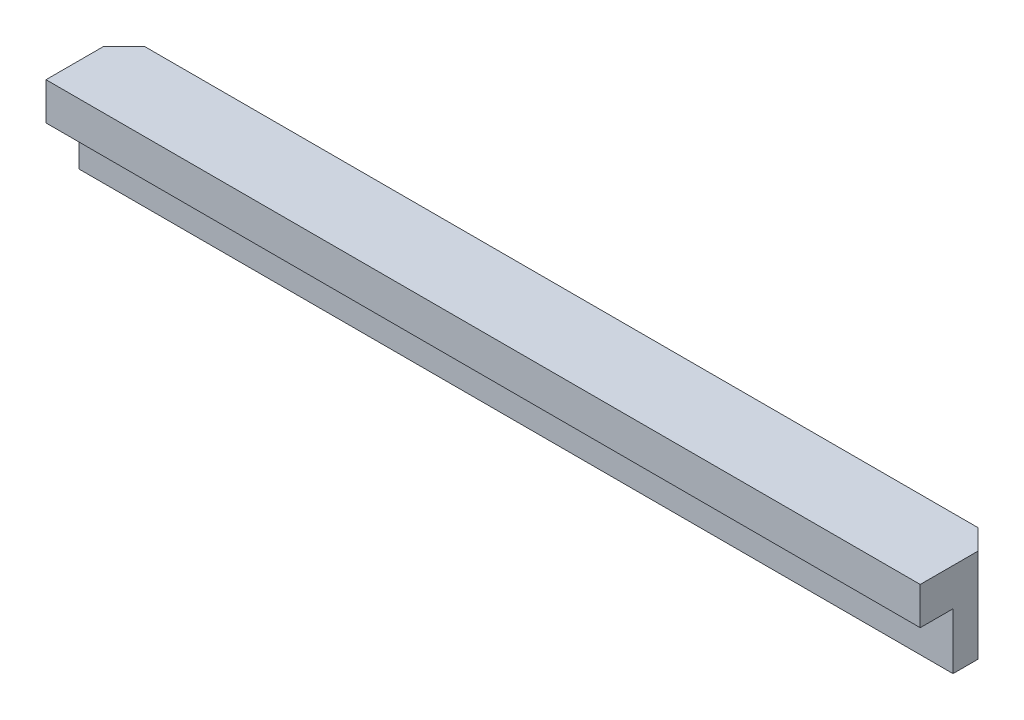
ISO-10303-21;
HEADER;
FILE_DESCRIPTION(('STEP AP214'),'2;1');
FILE_NAME('part.step','',(''),(''),'','','');
FILE_SCHEMA(('AUTOMOTIVE_DESIGN { 1 0 10303 214 1 1 1 1 }'));
ENDSEC;
DATA;
#1=APPLICATION_CONTEXT('core data for automotive mechanical design processes');
#2=APPLICATION_PROTOCOL_DEFINITION('international standard','automotive_design',2000,#1);
#3=PRODUCT_CONTEXT('',#1,'mechanical');
#4=PRODUCT('Part','Part','',(#3));
#5=PRODUCT_RELATED_PRODUCT_CATEGORY('part','',(#4));
#6=PRODUCT_DEFINITION_FORMATION('','',#4);
#7=PRODUCT_DEFINITION_CONTEXT('part definition',#1,'design');
#8=PRODUCT_DEFINITION('design','',#6,#7);
#9=PRODUCT_DEFINITION_SHAPE('','',#8);
#10=(LENGTH_UNIT() NAMED_UNIT(*) SI_UNIT(.MILLI.,.METRE.));
#11=(NAMED_UNIT(*) PLANE_ANGLE_UNIT() SI_UNIT($,.RADIAN.));
#12=(NAMED_UNIT(*) SI_UNIT($,.STERADIAN.) SOLID_ANGLE_UNIT());
#13=UNCERTAINTY_MEASURE_WITH_UNIT(LENGTH_MEASURE(1.E-05),#10,'distance_accuracy_value','');
#14=(GEOMETRIC_REPRESENTATION_CONTEXT(3) GLOBAL_UNCERTAINTY_ASSIGNED_CONTEXT((#13)) GLOBAL_UNIT_ASSIGNED_CONTEXT((#10,
#11,#12)) REPRESENTATION_CONTEXT('',''));
#15=CARTESIAN_POINT('',(0.,0.,0.));
#16=DIRECTION('',(0.,0.,1.));
#17=DIRECTION('',(1.,0.,0.));
#18=AXIS2_PLACEMENT_3D('',#15,#16,#17);
#19=CARTESIAN_POINT('',(140.,30.,-12.5));
#20=DIRECTION('',(-1.,0.,0.));
#21=DIRECTION('',(0.,0.,1.));
#22=AXIS2_PLACEMENT_3D('',#19,#20,#21);
#23=PLANE('',#22);
#24=DIRECTION('',(0.,0.,-1.));
#25=VECTOR('',#24,1.);
#26=CARTESIAN_POINT('',(140.,0.,-12.5));
#27=LINE('',#26,#25);
#28=CARTESIAN_POINT('',(140.,0.,2.));
#29=VERTEX_POINT('',#28);
#30=CARTESIAN_POINT('',(140.,0.,-5.99999999999994));
#31=VERTEX_POINT('',#30);
#32=EDGE_CURVE('E114',#29,#31,#27,.T.);
#33=ORIENTED_EDGE('',*,*,#32,.T.);
#34=DIRECTION('',(0.,1.,0.));
#35=VECTOR('',#34,1.);
#36=CARTESIAN_POINT('',(140.,30.,-5.99999999999994));
#37=LINE('',#36,#35);
#38=CARTESIAN_POINT('',(140.,30.,-5.99999999999991));
#39=VERTEX_POINT('',#38);
#40=EDGE_CURVE('E11',#31,#39,#37,.T.);
#41=ORIENTED_EDGE('',*,*,#40,.T.);
#42=DIRECTION('',(0.,0.,-1.));
#43=VECTOR('',#42,1.);
#44=CARTESIAN_POINT('',(140.,30.,-12.5));
#45=LINE('',#44,#43);
#46=CARTESIAN_POINT('',(140.,30.,12.5));
#47=VERTEX_POINT('',#46);
#48=EDGE_CURVE('E133',#47,#39,#45,.T.);
#49=ORIENTED_EDGE('',*,*,#48,.F.);
#50=DIRECTION('',(0.,-1.,0.));
#51=VECTOR('',#50,1.);
#52=CARTESIAN_POINT('',(140.,30.,12.5));
#53=LINE('',#52,#51);
#54=CARTESIAN_POINT('',(140.,18.,12.5));
#55=VERTEX_POINT('',#54);
#56=EDGE_CURVE('E134',#47,#55,#53,.T.);
#57=ORIENTED_EDGE('',*,*,#56,.T.);
#58=DIRECTION('',(0.,0.,1.));
#59=VECTOR('',#58,1.);
#60=CARTESIAN_POINT('',(140.,18.,12.5));
#61=LINE('',#60,#59);
#62=CARTESIAN_POINT('',(140.,18.,2.));
#63=VERTEX_POINT('',#62);
#64=EDGE_CURVE('E116',#63,#55,#61,.T.);
#65=ORIENTED_EDGE('',*,*,#64,.F.);
#66=DIRECTION('',(0.,1.,0.));
#67=VECTOR('',#66,1.);
#68=CARTESIAN_POINT('',(140.,0.,2.));
#69=LINE('',#68,#67);
#70=EDGE_CURVE('E104',#29,#63,#69,.T.);
#71=ORIENTED_EDGE('',*,*,#70,.F.);
#72=EDGE_LOOP('',(#33,#41,#49,#57,#65,#71));
#73=FACE_BOUND('',#72,.T.);
#74=ADVANCED_FACE('F32',(#73),#23,.F.);
#75=CARTESIAN_POINT('',(-140.,30.,-12.5));
#76=DIRECTION('',(0.,0.,1.));
#77=DIRECTION('',(1.,0.,0.));
#78=AXIS2_PLACEMENT_3D('',#75,#76,#77);
#79=PLANE('',#78);
#80=DIRECTION('',(-1.,0.,0.));
#81=VECTOR('',#80,1.);
#82=CARTESIAN_POINT('',(-140.,0.,-12.5));
#83=LINE('',#82,#81);
#84=CARTESIAN_POINT('',(133.5,0.,-12.5));
#85=VERTEX_POINT('',#84);
#86=CARTESIAN_POINT('',(-133.5,0.,-12.5));
#87=VERTEX_POINT('',#86);
#88=EDGE_CURVE('E121',#85,#87,#83,.T.);
#89=ORIENTED_EDGE('',*,*,#88,.T.);
#90=DIRECTION('',(0.,1.,0.));
#91=VECTOR('',#90,1.);
#92=CARTESIAN_POINT('',(-133.5,30.,-12.5));
#93=LINE('',#92,#91);
#94=CARTESIAN_POINT('',(-133.5,30.,-12.5));
#95=VERTEX_POINT('',#94);
#96=EDGE_CURVE('E53',#87,#95,#93,.T.);
#97=ORIENTED_EDGE('',*,*,#96,.T.);
#98=DIRECTION('',(-1.,0.,0.));
#99=VECTOR('',#98,1.);
#100=CARTESIAN_POINT('',(-140.,30.,-12.5));
#101=LINE('',#100,#99);
#102=CARTESIAN_POINT('',(133.5,30.,-12.5));
#103=VERTEX_POINT('',#102);
#104=EDGE_CURVE('E154',#103,#95,#101,.T.);
#105=ORIENTED_EDGE('',*,*,#104,.F.);
#106=DIRECTION('',(0.,-1.,0.));
#107=VECTOR('',#106,1.);
#108=CARTESIAN_POINT('',(133.5,30.,-12.5));
#109=LINE('',#108,#107);
#110=EDGE_CURVE('E143',#103,#85,#109,.T.);
#111=ORIENTED_EDGE('',*,*,#110,.T.);
#112=EDGE_LOOP('',(#89,#97,#105,#111));
#113=FACE_BOUND('',#112,.T.);
#114=ADVANCED_FACE('F161',(#113),#79,.F.);
#115=CARTESIAN_POINT('',(-140.,30.,-12.5));
#116=DIRECTION('',(1.,0.,0.));
#117=DIRECTION('',(0.,0.,-1.));
#118=AXIS2_PLACEMENT_3D('',#115,#116,#117);
#119=PLANE('',#118);
#120=DIRECTION('',(0.,0.,1.));
#121=VECTOR('',#120,1.);
#122=CARTESIAN_POINT('',(-140.,30.,-12.5));
#123=LINE('',#122,#121);
#124=CARTESIAN_POINT('',(-140.,30.,-5.99999999999997));
#125=VERTEX_POINT('',#124);
#126=CARTESIAN_POINT('',(-140.,30.,12.5));
#127=VERTEX_POINT('',#126);
#128=EDGE_CURVE('E152',#125,#127,#123,.T.);
#129=ORIENTED_EDGE('',*,*,#128,.F.);
#130=DIRECTION('',(0.,-1.,0.));
#131=VECTOR('',#130,1.);
#132=CARTESIAN_POINT('',(-140.,30.,-5.99999999999999));
#133=LINE('',#132,#131);
#134=CARTESIAN_POINT('',(-140.,0.,-6.));
#135=VERTEX_POINT('',#134);
#136=EDGE_CURVE('E111',#125,#135,#133,.T.);
#137=ORIENTED_EDGE('',*,*,#136,.T.);
#138=DIRECTION('',(0.,0.,1.));
#139=VECTOR('',#138,1.);
#140=CARTESIAN_POINT('',(-140.,0.,-12.5));
#141=LINE('',#140,#139);
#142=CARTESIAN_POINT('',(-140.,0.,2.));
#143=VERTEX_POINT('',#142);
#144=EDGE_CURVE('E124',#135,#143,#141,.T.);
#145=ORIENTED_EDGE('',*,*,#144,.T.);
#146=DIRECTION('',(0.,1.,0.));
#147=VECTOR('',#146,1.);
#148=CARTESIAN_POINT('',(-140.,30.,2.));
#149=LINE('',#148,#147);
#150=CARTESIAN_POINT('',(-140.,18.,2.));
#151=VERTEX_POINT('',#150);
#152=EDGE_CURVE('E107',#143,#151,#149,.T.);
#153=ORIENTED_EDGE('',*,*,#152,.T.);
#154=DIRECTION('',(0.,0.,1.));
#155=VECTOR('',#154,1.);
#156=CARTESIAN_POINT('',(-140.,18.,-12.5));
#157=LINE('',#156,#155);
#158=CARTESIAN_POINT('',(-140.,18.,12.5));
#159=VERTEX_POINT('',#158);
#160=EDGE_CURVE('E122',#151,#159,#157,.T.);
#161=ORIENTED_EDGE('',*,*,#160,.T.);
#162=DIRECTION('',(0.,-1.,0.));
#163=VECTOR('',#162,1.);
#164=CARTESIAN_POINT('',(-140.,30.,12.5));
#165=LINE('',#164,#163);
#166=EDGE_CURVE('E112',#127,#159,#165,.T.);
#167=ORIENTED_EDGE('',*,*,#166,.F.);
#168=EDGE_LOOP('',(#129,#137,#145,#153,#161,#167));
#169=FACE_BOUND('',#168,.T.);
#170=ADVANCED_FACE('F158',(#169),#119,.F.);
#171=CARTESIAN_POINT('',(-140.,30.,12.5));
#172=DIRECTION('',(0.,0.,-1.));
#173=DIRECTION('',(-1.,0.,0.));
#174=AXIS2_PLACEMENT_3D('',#171,#172,#173);
#175=PLANE('',#174);
#176=ORIENTED_EDGE('',*,*,#166,.T.);
#177=DIRECTION('',(1.,0.,0.));
#178=VECTOR('',#177,1.);
#179=CARTESIAN_POINT('',(-160.,18.,12.5));
#180=LINE('',#179,#178);
#181=EDGE_CURVE('E170',#159,#55,#180,.T.);
#182=ORIENTED_EDGE('',*,*,#181,.T.);
#183=ORIENTED_EDGE('',*,*,#56,.F.);
#184=DIRECTION('',(1.,0.,0.));
#185=VECTOR('',#184,1.);
#186=CARTESIAN_POINT('',(-140.,30.,12.5));
#187=LINE('',#186,#185);
#188=EDGE_CURVE('E129',#127,#47,#187,.T.);
#189=ORIENTED_EDGE('',*,*,#188,.F.);
#190=EDGE_LOOP('',(#176,#182,#183,#189));
#191=FACE_BOUND('',#190,.T.);
#192=ADVANCED_FACE('F178',(#191),#175,.F.);
#193=CARTESIAN_POINT('',(0.,30.,0.));
#194=DIRECTION('',(0.,1.,0.));
#195=DIRECTION('',(0.,0.,1.));
#196=AXIS2_PLACEMENT_3D('',#193,#194,#195);
#197=PLANE('',#196);
#198=ORIENTED_EDGE('',*,*,#104,.T.);
#199=DIRECTION('',(0.707106781186551,0.,-0.707106781186545));
#200=VECTOR('',#199,1.);
#201=CARTESIAN_POINT('',(-72.9999999999994,30.,-73.));
#202=LINE('',#201,#200);
#203=EDGE_CURVE('E40',#95,#125,#202,.F.);
#204=ORIENTED_EDGE('',*,*,#203,.T.);
#205=ORIENTED_EDGE('',*,*,#128,.T.);
#206=ORIENTED_EDGE('',*,*,#188,.T.);
#207=ORIENTED_EDGE('',*,*,#48,.T.);
#208=DIRECTION('',(0.707106781186545,0.,0.707106781186551));
#209=VECTOR('',#208,1.);
#210=CARTESIAN_POINT('',(73.0000000000006,30.,-73.));
#211=LINE('',#210,#209);
#212=EDGE_CURVE('E147',#39,#103,#211,.F.);
#213=ORIENTED_EDGE('',*,*,#212,.T.);
#214=EDGE_LOOP('',(#198,#204,#205,#206,#207,#213));
#215=FACE_BOUND('',#214,.T.);
#216=ADVANCED_FACE('F151',(#215),#197,.T.);
#217=CARTESIAN_POINT('',(0.,0.,0.));
#218=DIRECTION('',(0.,1.,0.));
#219=DIRECTION('',(0.,0.,1.));
#220=AXIS2_PLACEMENT_3D('',#217,#218,#219);
#221=PLANE('',#220);
#222=ORIENTED_EDGE('',*,*,#144,.F.);
#223=DIRECTION('',(-0.707106781186551,0.,0.707106781186545));
#224=VECTOR('',#223,1.);
#225=CARTESIAN_POINT('',(-140.,0.,-5.99999999999999));
#226=LINE('',#225,#224);
#227=EDGE_CURVE('E141',#135,#87,#226,.F.);
#228=ORIENTED_EDGE('',*,*,#227,.T.);
#229=ORIENTED_EDGE('',*,*,#88,.F.);
#230=DIRECTION('',(-0.707106781186545,0.,-0.707106781186551));
#231=VECTOR('',#230,1.);
#232=CARTESIAN_POINT('',(133.5,0.,-12.5));
#233=LINE('',#232,#231);
#234=EDGE_CURVE('E120',#85,#31,#233,.F.);
#235=ORIENTED_EDGE('',*,*,#234,.T.);
#236=ORIENTED_EDGE('',*,*,#32,.F.);
#237=DIRECTION('',(-1.,0.,0.));
#238=VECTOR('',#237,1.);
#239=CARTESIAN_POINT('',(0.,0.,2.));
#240=LINE('',#239,#238);
#241=EDGE_CURVE('E100',#29,#143,#240,.T.);
#242=ORIENTED_EDGE('',*,*,#241,.T.);
#243=EDGE_LOOP('',(#222,#228,#229,#235,#236,#242));
#244=FACE_BOUND('',#243,.T.);
#245=ADVANCED_FACE('F118',(#244),#221,.F.);
#246=CARTESIAN_POINT('',(-160.,18.,12.5));
#247=DIRECTION('',(0.,1.,0.));
#248=DIRECTION('',(0.,0.,1.));
#249=AXIS2_PLACEMENT_3D('',#246,#247,#248);
#250=PLANE('',#249);
#251=DIRECTION('',(1.,0.,0.));
#252=VECTOR('',#251,1.);
#253=CARTESIAN_POINT('',(-160.,18.,2.));
#254=LINE('',#253,#252);
#255=EDGE_CURVE('E171',#151,#63,#254,.T.);
#256=ORIENTED_EDGE('',*,*,#255,.T.);
#257=ORIENTED_EDGE('',*,*,#64,.T.);
#258=ORIENTED_EDGE('',*,*,#181,.F.);
#259=ORIENTED_EDGE('',*,*,#160,.F.);
#260=EDGE_LOOP('',(#256,#257,#258,#259));
#261=FACE_BOUND('',#260,.T.);
#262=ADVANCED_FACE('F176',(#261),#250,.F.);
#263=CARTESIAN_POINT('',(-160.,0.,2.));
#264=DIRECTION('',(0.,0.,-1.));
#265=DIRECTION('',(-1.,0.,0.));
#266=AXIS2_PLACEMENT_3D('',#263,#264,#265);
#267=PLANE('',#266);
#268=ORIENTED_EDGE('',*,*,#241,.F.);
#269=ORIENTED_EDGE('',*,*,#70,.T.);
#270=ORIENTED_EDGE('',*,*,#255,.F.);
#271=ORIENTED_EDGE('',*,*,#152,.F.);
#272=EDGE_LOOP('',(#268,#269,#270,#271));
#273=FACE_BOUND('',#272,.T.);
#274=ADVANCED_FACE('F102',(#273),#267,.F.);
#275=CARTESIAN_POINT('',(-140.,30.,-5.99999999999999));
#276=DIRECTION('',(0.707106781186545,0.,0.707106781186551));
#277=DIRECTION('',(0.,-1.,0.));
#278=AXIS2_PLACEMENT_3D('',#275,#276,#277);
#279=PLANE('',#278);
#280=ORIENTED_EDGE('',*,*,#203,.F.);
#281=ORIENTED_EDGE('',*,*,#96,.F.);
#282=ORIENTED_EDGE('',*,*,#227,.F.);
#283=ORIENTED_EDGE('',*,*,#136,.F.);
#284=EDGE_LOOP('',(#280,#281,#282,#283));
#285=FACE_BOUND('',#284,.T.);
#286=ADVANCED_FACE('F160',(#285),#279,.F.);
#287=CARTESIAN_POINT('',(133.5,30.,-12.5));
#288=DIRECTION('',(-0.707106781186551,0.,0.707106781186545));
#289=DIRECTION('',(0.,-1.,0.));
#290=AXIS2_PLACEMENT_3D('',#287,#288,#289);
#291=PLANE('',#290);
#292=ORIENTED_EDGE('',*,*,#212,.F.);
#293=ORIENTED_EDGE('',*,*,#40,.F.);
#294=ORIENTED_EDGE('',*,*,#234,.F.);
#295=ORIENTED_EDGE('',*,*,#110,.F.);
#296=EDGE_LOOP('',(#292,#293,#294,#295));
#297=FACE_BOUND('',#296,.T.);
#298=ADVANCED_FACE('F34',(#297),#291,.F.);
#299=CLOSED_SHELL('',(#74,#114,#170,#192,#216,#245,#262,#274,#286,#298));
#300=MANIFOLD_SOLID_BREP('B2',#299);
#301=ADVANCED_BREP_SHAPE_REPRESENTATION('',(#18,#300),#14);
#302=SHAPE_DEFINITION_REPRESENTATION(#9,#301);
ENDSEC;
END-ISO-10303-21;
